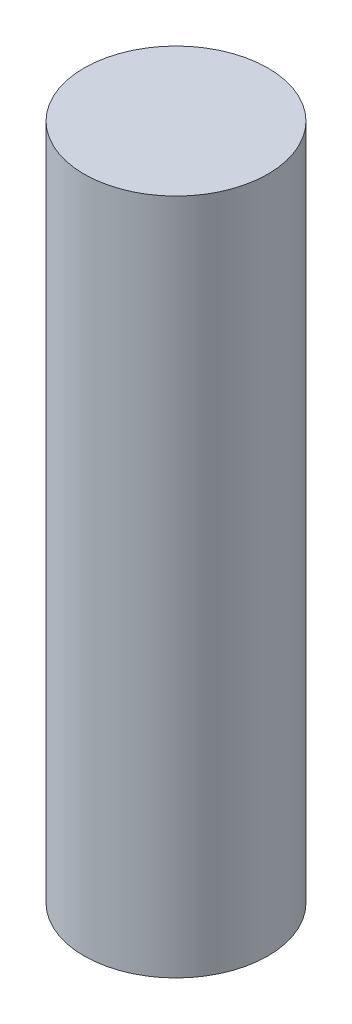
ISO-10303-21;
HEADER;
FILE_DESCRIPTION(('STEP AP214'),'2;1');
FILE_NAME('part.step','',(''),(''),'','','');
FILE_SCHEMA(('AUTOMOTIVE_DESIGN { 1 0 10303 214 1 1 1 1 }'));
ENDSEC;
DATA;
#1=APPLICATION_CONTEXT('core data for automotive mechanical design processes');
#2=APPLICATION_PROTOCOL_DEFINITION('international standard','automotive_design',2000,#1);
#3=PRODUCT_CONTEXT('',#1,'mechanical');
#4=PRODUCT('Part','Part','',(#3));
#5=PRODUCT_RELATED_PRODUCT_CATEGORY('part','',(#4));
#6=PRODUCT_DEFINITION_FORMATION('','',#4);
#7=PRODUCT_DEFINITION_CONTEXT('part definition',#1,'design');
#8=PRODUCT_DEFINITION('design','',#6,#7);
#9=PRODUCT_DEFINITION_SHAPE('','',#8);
#10=(LENGTH_UNIT() NAMED_UNIT(*) SI_UNIT(.MILLI.,.METRE.));
#11=(NAMED_UNIT(*) PLANE_ANGLE_UNIT() SI_UNIT($,.RADIAN.));
#12=(NAMED_UNIT(*) SI_UNIT($,.STERADIAN.) SOLID_ANGLE_UNIT());
#13=UNCERTAINTY_MEASURE_WITH_UNIT(LENGTH_MEASURE(1.E-05),#10,'distance_accuracy_value','');
#14=(GEOMETRIC_REPRESENTATION_CONTEXT(3) GLOBAL_UNCERTAINTY_ASSIGNED_CONTEXT((#13)) GLOBAL_UNIT_ASSIGNED_CONTEXT((#10,
#11,#12)) REPRESENTATION_CONTEXT('',''));
#15=CARTESIAN_POINT('',(0.,0.,0.));
#16=DIRECTION('',(0.,0.,1.));
#17=DIRECTION('',(1.,0.,0.));
#18=AXIS2_PLACEMENT_3D('',#15,#16,#17);
#19=CARTESIAN_POINT('',(0.,55.25,0.));
#20=DIRECTION('',(0.,-1.,0.));
#21=DIRECTION('',(0.,0.,-1.));
#22=AXIS2_PLACEMENT_3D('',#19,#20,#21);
#23=CYLINDRICAL_SURFACE('',#22,7.5);
#24=CARTESIAN_POINT('',(0.,55.25,0.));
#25=DIRECTION('',(0.,1.,0.));
#26=DIRECTION('',(0.,0.,1.));
#27=AXIS2_PLACEMENT_3D('',#24,#25,#26);
#28=CIRCLE('',#27,7.5);
#29=CARTESIAN_POINT('',(0.,55.25,7.5));
#30=VERTEX_POINT('',#29);
#31=EDGE_CURVE('E10',#30,#30,#28,.T.);
#32=ORIENTED_EDGE('',*,*,#31,.F.);
#33=EDGE_LOOP('',(#32));
#34=FACE_BOUND('',#33,.T.);
#35=CARTESIAN_POINT('',(0.,0.,0.));
#36=DIRECTION('',(0.,1.,0.));
#37=DIRECTION('',(0.,0.,1.));
#38=AXIS2_PLACEMENT_3D('',#35,#36,#37);
#39=CIRCLE('',#38,7.5);
#40=CARTESIAN_POINT('',(0.,0.,7.5));
#41=VERTEX_POINT('',#40);
#42=EDGE_CURVE('E34',#41,#41,#39,.T.);
#43=ORIENTED_EDGE('',*,*,#42,.T.);
#44=EDGE_LOOP('',(#43));
#45=FACE_BOUND('',#44,.T.);
#46=ADVANCED_FACE('F31',(#34,#45),#23,.T.);
#47=CARTESIAN_POINT('',(0.,55.25,0.));
#48=DIRECTION('',(0.,1.,0.));
#49=DIRECTION('',(0.,0.,1.));
#50=AXIS2_PLACEMENT_3D('',#47,#48,#49);
#51=PLANE('',#50);
#52=ORIENTED_EDGE('',*,*,#31,.T.);
#53=EDGE_LOOP('',(#52));
#54=FACE_BOUND('',#53,.T.);
#55=ADVANCED_FACE('F46',(#54),#51,.T.);
#56=CARTESIAN_POINT('',(0.,0.,0.));
#57=DIRECTION('',(0.,1.,0.));
#58=DIRECTION('',(0.,0.,1.));
#59=AXIS2_PLACEMENT_3D('',#56,#57,#58);
#60=PLANE('',#59);
#61=ORIENTED_EDGE('',*,*,#42,.F.);
#62=EDGE_LOOP('',(#61));
#63=FACE_BOUND('',#62,.T.);
#64=ADVANCED_FACE('F44',(#63),#60,.F.);
#65=CLOSED_SHELL('',(#46,#55,#64));
#66=MANIFOLD_SOLID_BREP('B2',#65);
#67=ADVANCED_BREP_SHAPE_REPRESENTATION('',(#18,#66),#14);
#68=SHAPE_DEFINITION_REPRESENTATION(#9,#67);
ENDSEC;
END-ISO-10303-21;
